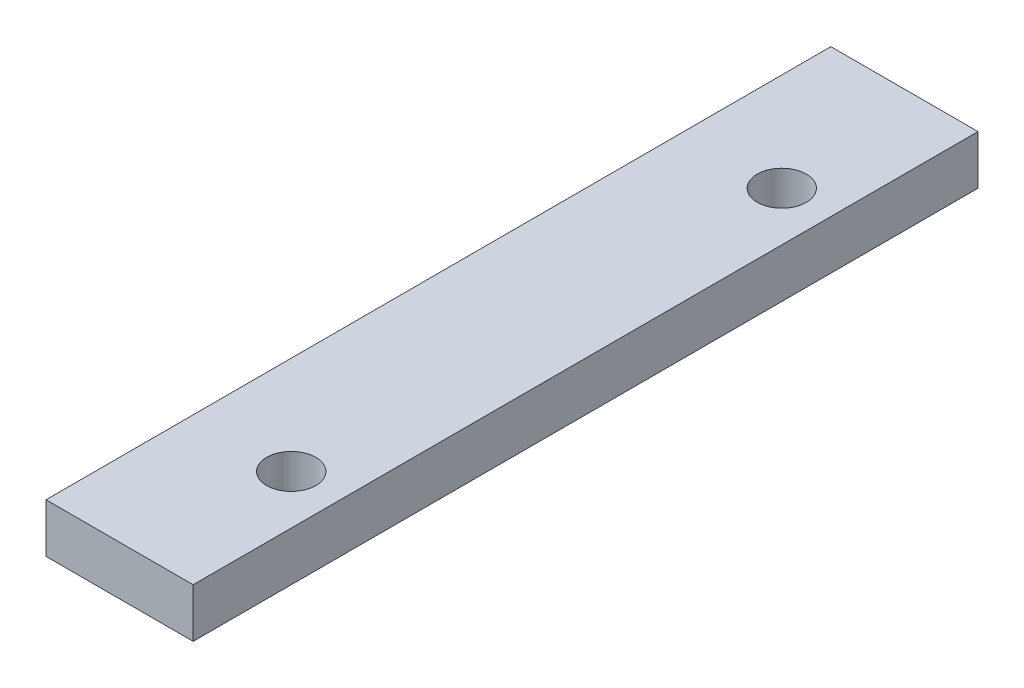
ISO-10303-21;
HEADER;
FILE_DESCRIPTION(('STEP AP214'),'2;1');
FILE_NAME('part.step','',(''),(''),'','','');
FILE_SCHEMA(('AUTOMOTIVE_DESIGN { 1 0 10303 214 1 1 1 1 }'));
ENDSEC;
DATA;
#1=APPLICATION_CONTEXT('core data for automotive mechanical design processes');
#2=APPLICATION_PROTOCOL_DEFINITION('international standard','automotive_design',2000,#1);
#3=PRODUCT_CONTEXT('',#1,'mechanical');
#4=PRODUCT('Part','Part','',(#3));
#5=PRODUCT_RELATED_PRODUCT_CATEGORY('part','',(#4));
#6=PRODUCT_DEFINITION_FORMATION('','',#4);
#7=PRODUCT_DEFINITION_CONTEXT('part definition',#1,'design');
#8=PRODUCT_DEFINITION('design','',#6,#7);
#9=PRODUCT_DEFINITION_SHAPE('','',#8);
#10=(LENGTH_UNIT() NAMED_UNIT(*) SI_UNIT(.MILLI.,.METRE.));
#11=(NAMED_UNIT(*) PLANE_ANGLE_UNIT() SI_UNIT($,.RADIAN.));
#12=(NAMED_UNIT(*) SI_UNIT($,.STERADIAN.) SOLID_ANGLE_UNIT());
#13=UNCERTAINTY_MEASURE_WITH_UNIT(LENGTH_MEASURE(1.E-05),#10,'distance_accuracy_value','');
#14=(GEOMETRIC_REPRESENTATION_CONTEXT(3) GLOBAL_UNCERTAINTY_ASSIGNED_CONTEXT((#13)) GLOBAL_UNIT_ASSIGNED_CONTEXT((#10,
#11,#12)) REPRESENTATION_CONTEXT('',''));
#15=CARTESIAN_POINT('',(0.,0.,0.));
#16=DIRECTION('',(0.,0.,1.));
#17=DIRECTION('',(1.,0.,0.));
#18=AXIS2_PLACEMENT_3D('',#15,#16,#17);
#19=CARTESIAN_POINT('',(-9.525,3.175,50.8));
#20=DIRECTION('',(1.,0.,0.));
#21=DIRECTION('',(0.,0.,-1.));
#22=AXIS2_PLACEMENT_3D('',#19,#20,#21);
#23=PLANE('',#22);
#24=DIRECTION('',(0.,0.,1.));
#25=VECTOR('',#24,1.);
#26=CARTESIAN_POINT('',(-9.525,-3.175,50.8));
#27=LINE('',#26,#25);
#28=CARTESIAN_POINT('',(-9.525,-3.175,-50.8));
#29=VERTEX_POINT('',#28);
#30=CARTESIAN_POINT('',(-9.525,-3.175,50.8));
#31=VERTEX_POINT('',#30);
#32=EDGE_CURVE('E96',#29,#31,#27,.T.);
#33=ORIENTED_EDGE('',*,*,#32,.T.);
#34=DIRECTION('',(0.,-1.,0.));
#35=VECTOR('',#34,1.);
#36=CARTESIAN_POINT('',(-9.525,3.175,50.8));
#37=LINE('',#36,#35);
#38=CARTESIAN_POINT('',(-9.525,3.175,50.8));
#39=VERTEX_POINT('',#38);
#40=EDGE_CURVE('E11',#39,#31,#37,.T.);
#41=ORIENTED_EDGE('',*,*,#40,.F.);
#42=DIRECTION('',(0.,0.,1.));
#43=VECTOR('',#42,1.);
#44=CARTESIAN_POINT('',(-9.525,3.175,50.8));
#45=LINE('',#44,#43);
#46=CARTESIAN_POINT('',(-9.525,3.175,-50.8));
#47=VERTEX_POINT('',#46);
#48=EDGE_CURVE('E84',#47,#39,#45,.T.);
#49=ORIENTED_EDGE('',*,*,#48,.F.);
#50=DIRECTION('',(0.,-1.,0.));
#51=VECTOR('',#50,1.);
#52=CARTESIAN_POINT('',(-9.525,3.175,-50.8));
#53=LINE('',#52,#51);
#54=EDGE_CURVE('E92',#47,#29,#53,.T.);
#55=ORIENTED_EDGE('',*,*,#54,.T.);
#56=EDGE_LOOP('',(#33,#41,#49,#55));
#57=FACE_BOUND('',#56,.T.);
#58=ADVANCED_FACE('F33',(#57),#23,.F.);
#59=CARTESIAN_POINT('',(9.525,3.175,50.8));
#60=DIRECTION('',(0.,0.,-1.));
#61=DIRECTION('',(-1.,0.,0.));
#62=AXIS2_PLACEMENT_3D('',#59,#60,#61);
#63=PLANE('',#62);
#64=DIRECTION('',(1.,0.,0.));
#65=VECTOR('',#64,1.);
#66=CARTESIAN_POINT('',(9.525,-3.175,50.8));
#67=LINE('',#66,#65);
#68=CARTESIAN_POINT('',(9.525,-3.175,50.8));
#69=VERTEX_POINT('',#68);
#70=EDGE_CURVE('E88',#31,#69,#67,.T.);
#71=ORIENTED_EDGE('',*,*,#70,.T.);
#72=DIRECTION('',(0.,-1.,0.));
#73=VECTOR('',#72,1.);
#74=CARTESIAN_POINT('',(9.525,3.175,50.8));
#75=LINE('',#74,#73);
#76=CARTESIAN_POINT('',(9.525,3.175,50.8));
#77=VERTEX_POINT('',#76);
#78=EDGE_CURVE('E41',#77,#69,#75,.T.);
#79=ORIENTED_EDGE('',*,*,#78,.F.);
#80=DIRECTION('',(1.,0.,0.));
#81=VECTOR('',#80,1.);
#82=CARTESIAN_POINT('',(9.525,3.175,50.8));
#83=LINE('',#82,#81);
#84=EDGE_CURVE('E79',#39,#77,#83,.T.);
#85=ORIENTED_EDGE('',*,*,#84,.F.);
#86=ORIENTED_EDGE('',*,*,#40,.T.);
#87=EDGE_LOOP('',(#71,#79,#85,#86));
#88=FACE_BOUND('',#87,.T.);
#89=ADVANCED_FACE('F87',(#88),#63,.F.);
#90=CARTESIAN_POINT('',(9.525,3.175,50.8));
#91=DIRECTION('',(-1.,0.,0.));
#92=DIRECTION('',(0.,0.,1.));
#93=AXIS2_PLACEMENT_3D('',#90,#91,#92);
#94=PLANE('',#93);
#95=DIRECTION('',(0.,0.,-1.));
#96=VECTOR('',#95,1.);
#97=CARTESIAN_POINT('',(9.525,-3.175,50.8));
#98=LINE('',#97,#96);
#99=CARTESIAN_POINT('',(9.525,-3.175,-50.8));
#100=VERTEX_POINT('',#99);
#101=EDGE_CURVE('E66',#69,#100,#98,.T.);
#102=ORIENTED_EDGE('',*,*,#101,.T.);
#103=DIRECTION('',(0.,-1.,0.));
#104=VECTOR('',#103,1.);
#105=CARTESIAN_POINT('',(9.525,3.175,-50.8));
#106=LINE('',#105,#104);
#107=CARTESIAN_POINT('',(9.525,3.175,-50.8));
#108=VERTEX_POINT('',#107);
#109=EDGE_CURVE('E89',#108,#100,#106,.T.);
#110=ORIENTED_EDGE('',*,*,#109,.F.);
#111=DIRECTION('',(0.,0.,-1.));
#112=VECTOR('',#111,1.);
#113=CARTESIAN_POINT('',(9.525,3.175,50.8));
#114=LINE('',#113,#112);
#115=EDGE_CURVE('E82',#77,#108,#114,.T.);
#116=ORIENTED_EDGE('',*,*,#115,.F.);
#117=ORIENTED_EDGE('',*,*,#78,.T.);
#118=EDGE_LOOP('',(#102,#110,#116,#117));
#119=FACE_BOUND('',#118,.T.);
#120=ADVANCED_FACE('F90',(#119),#94,.F.);
#121=CARTESIAN_POINT('',(9.525,3.175,-50.8));
#122=DIRECTION('',(0.,0.,1.));
#123=DIRECTION('',(1.,0.,0.));
#124=AXIS2_PLACEMENT_3D('',#121,#122,#123);
#125=PLANE('',#124);
#126=DIRECTION('',(-1.,0.,0.));
#127=VECTOR('',#126,1.);
#128=CARTESIAN_POINT('',(9.525,-3.175,-50.8));
#129=LINE('',#128,#127);
#130=EDGE_CURVE('E72',#100,#29,#129,.T.);
#131=ORIENTED_EDGE('',*,*,#130,.T.);
#132=ORIENTED_EDGE('',*,*,#54,.F.);
#133=DIRECTION('',(-1.,0.,0.));
#134=VECTOR('',#133,1.);
#135=CARTESIAN_POINT('',(9.525,3.175,-50.8));
#136=LINE('',#135,#134);
#137=EDGE_CURVE('E49',#108,#47,#136,.T.);
#138=ORIENTED_EDGE('',*,*,#137,.F.);
#139=ORIENTED_EDGE('',*,*,#109,.T.);
#140=EDGE_LOOP('',(#131,#132,#138,#139));
#141=FACE_BOUND('',#140,.T.);
#142=ADVANCED_FACE('F104',(#141),#125,.F.);
#143=CARTESIAN_POINT('',(0.,3.175,0.));
#144=DIRECTION('',(0.,1.,0.));
#145=DIRECTION('',(0.,0.,1.));
#146=AXIS2_PLACEMENT_3D('',#143,#144,#145);
#147=PLANE('',#146);
#148=CARTESIAN_POINT('',(3.175,3.175,31.75));
#149=DIRECTION('',(0.,1.,0.));
#150=DIRECTION('',(0.,0.,1.));
#151=AXIS2_PLACEMENT_3D('',#148,#149,#150);
#152=CIRCLE('',#151,3.17499999999999);
#153=CARTESIAN_POINT('',(3.175,3.175,34.925));
#154=VERTEX_POINT('',#153);
#155=EDGE_CURVE('E118',#154,#154,#152,.T.);
#156=ORIENTED_EDGE('',*,*,#155,.F.);
#157=EDGE_LOOP('',(#156));
#158=FACE_BOUND('',#157,.T.);
#159=CARTESIAN_POINT('',(3.175,3.175,-31.75));
#160=DIRECTION('',(0.,1.,0.));
#161=DIRECTION('',(0.,0.,1.));
#162=AXIS2_PLACEMENT_3D('',#159,#160,#161);
#163=CIRCLE('',#162,3.17499999999999);
#164=CARTESIAN_POINT('',(3.175,3.175,-28.575));
#165=VERTEX_POINT('',#164);
#166=EDGE_CURVE('E112',#165,#165,#163,.T.);
#167=ORIENTED_EDGE('',*,*,#166,.F.);
#168=EDGE_LOOP('',(#167));
#169=FACE_BOUND('',#168,.T.);
#170=ORIENTED_EDGE('',*,*,#48,.T.);
#171=ORIENTED_EDGE('',*,*,#84,.T.);
#172=ORIENTED_EDGE('',*,*,#115,.T.);
#173=ORIENTED_EDGE('',*,*,#137,.T.);
#174=EDGE_LOOP('',(#170,#171,#172,#173));
#175=FACE_BOUND('',#174,.T.);
#176=ADVANCED_FACE('F80',(#158,#169,#175),#147,.T.);
#177=CARTESIAN_POINT('',(0.,-3.175,0.));
#178=DIRECTION('',(0.,1.,0.));
#179=DIRECTION('',(0.,0.,1.));
#180=AXIS2_PLACEMENT_3D('',#177,#178,#179);
#181=PLANE('',#180);
#182=CARTESIAN_POINT('',(3.175,-3.175,31.75));
#183=DIRECTION('',(0.,1.,0.));
#184=DIRECTION('',(0.,0.,1.));
#185=AXIS2_PLACEMENT_3D('',#182,#183,#184);
#186=CIRCLE('',#185,3.175);
#187=CARTESIAN_POINT('',(3.175,-3.175,34.925));
#188=VERTEX_POINT('',#187);
#189=EDGE_CURVE('E115',#188,#188,#186,.T.);
#190=ORIENTED_EDGE('',*,*,#189,.T.);
#191=EDGE_LOOP('',(#190));
#192=FACE_BOUND('',#191,.T.);
#193=CARTESIAN_POINT('',(3.175,-3.175,-31.75));
#194=DIRECTION('',(0.,1.,0.));
#195=DIRECTION('',(0.,0.,1.));
#196=AXIS2_PLACEMENT_3D('',#193,#194,#195);
#197=CIRCLE('',#196,3.175);
#198=CARTESIAN_POINT('',(3.175,-3.175,-28.575));
#199=VERTEX_POINT('',#198);
#200=EDGE_CURVE('E99',#199,#199,#197,.T.);
#201=ORIENTED_EDGE('',*,*,#200,.T.);
#202=EDGE_LOOP('',(#201));
#203=FACE_BOUND('',#202,.T.);
#204=ORIENTED_EDGE('',*,*,#32,.F.);
#205=ORIENTED_EDGE('',*,*,#130,.F.);
#206=ORIENTED_EDGE('',*,*,#101,.F.);
#207=ORIENTED_EDGE('',*,*,#70,.F.);
#208=EDGE_LOOP('',(#204,#205,#206,#207));
#209=FACE_BOUND('',#208,.T.);
#210=ADVANCED_FACE('F107',(#192,#203,#209),#181,.F.);
#211=CARTESIAN_POINT('',(3.175,3.175,-31.75));
#212=DIRECTION('',(0.,1.,0.));
#213=DIRECTION('',(0.,0.,1.));
#214=AXIS2_PLACEMENT_3D('',#211,#212,#213);
#215=CYLINDRICAL_SURFACE('',#214,3.17499999999999);
#216=ORIENTED_EDGE('',*,*,#200,.F.);
#217=EDGE_LOOP('',(#216));
#218=FACE_BOUND('',#217,.T.);
#219=ORIENTED_EDGE('',*,*,#166,.T.);
#220=EDGE_LOOP('',(#219));
#221=FACE_BOUND('',#220,.T.);
#222=ADVANCED_FACE('F129',(#218,#221),#215,.F.);
#223=CARTESIAN_POINT('',(3.175,3.175,31.75));
#224=DIRECTION('',(0.,1.,0.));
#225=DIRECTION('',(0.,0.,1.));
#226=AXIS2_PLACEMENT_3D('',#223,#224,#225);
#227=CYLINDRICAL_SURFACE('',#226,3.17499999999999);
#228=ORIENTED_EDGE('',*,*,#189,.F.);
#229=EDGE_LOOP('',(#228));
#230=FACE_BOUND('',#229,.T.);
#231=ORIENTED_EDGE('',*,*,#155,.T.);
#232=EDGE_LOOP('',(#231));
#233=FACE_BOUND('',#232,.T.);
#234=ADVANCED_FACE('F122',(#230,#233),#227,.F.);
#235=CLOSED_SHELL('',(#58,#89,#120,#142,#176,#210,#222,#234));
#236=MANIFOLD_SOLID_BREP('B2',#235);
#237=ADVANCED_BREP_SHAPE_REPRESENTATION('',(#18,#236),#14);
#238=SHAPE_DEFINITION_REPRESENTATION(#9,#237);
ENDSEC;
END-ISO-10303-21;
